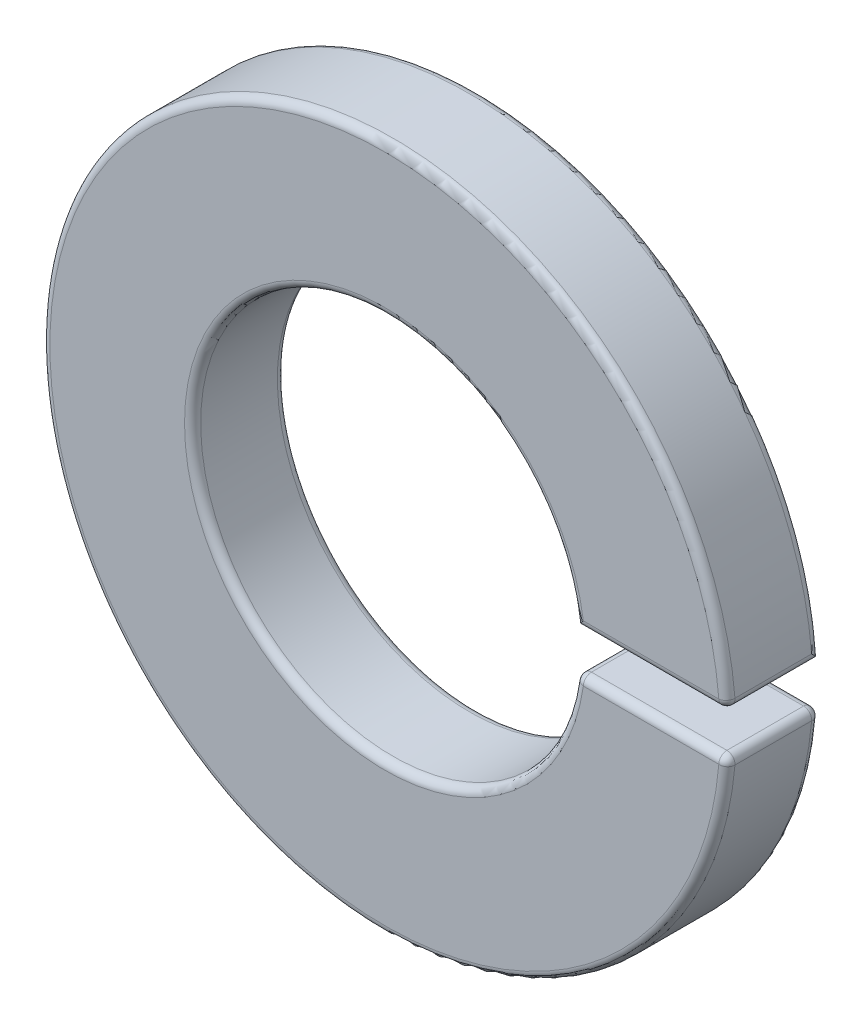
ISO-10303-21;
HEADER;
FILE_DESCRIPTION(('STEP AP214'),'2;1');
FILE_NAME('part.step','',(''),(''),'','','');
FILE_SCHEMA(('AUTOMOTIVE_DESIGN { 1 0 10303 214 1 1 1 1 }'));
ENDSEC;
DATA;
#1=APPLICATION_CONTEXT('core data for automotive mechanical design processes');
#2=APPLICATION_PROTOCOL_DEFINITION('international standard','automotive_design',2000,#1);
#3=PRODUCT_CONTEXT('',#1,'mechanical');
#4=PRODUCT('Part','Part','',(#3));
#5=PRODUCT_RELATED_PRODUCT_CATEGORY('part','',(#4));
#6=PRODUCT_DEFINITION_FORMATION('','',#4);
#7=PRODUCT_DEFINITION_CONTEXT('part definition',#1,'design');
#8=PRODUCT_DEFINITION('design','',#6,#7);
#9=PRODUCT_DEFINITION_SHAPE('','',#8);
#10=(LENGTH_UNIT() NAMED_UNIT(*) SI_UNIT(.MILLI.,.METRE.));
#11=(NAMED_UNIT(*) PLANE_ANGLE_UNIT() SI_UNIT($,.RADIAN.));
#12=(NAMED_UNIT(*) SI_UNIT($,.STERADIAN.) SOLID_ANGLE_UNIT());
#13=UNCERTAINTY_MEASURE_WITH_UNIT(LENGTH_MEASURE(1.E-05),#10,'distance_accuracy_value','');
#14=(GEOMETRIC_REPRESENTATION_CONTEXT(3) GLOBAL_UNCERTAINTY_ASSIGNED_CONTEXT((#13)) GLOBAL_UNIT_ASSIGNED_CONTEXT((#10,
#11,#12)) REPRESENTATION_CONTEXT('',''));
#15=CARTESIAN_POINT('',(0.,0.,0.));
#16=DIRECTION('',(0.,0.,1.));
#17=DIRECTION('',(1.,0.,0.));
#18=AXIS2_PLACEMENT_3D('',#15,#16,#17);
#19=CARTESIAN_POINT('',(0.,0.,2.3));
#20=DIRECTION('',(0.,0.,-1.));
#21=DIRECTION('',(-1.,0.,0.));
#22=AXIS2_PLACEMENT_3D('',#19,#20,#21);
#23=CYLINDRICAL_SURFACE('',#22,4.765);
#24=DIRECTION('',(0.,0.,-1.));
#25=VECTOR('',#24,1.);
#26=CARTESIAN_POINT('',(4.71740460868127,-0.671802618328298,2.3));
#27=LINE('',#26,#25);
#28=CARTESIAN_POINT('',(4.71740460868127,-0.671802618328298,2.1));
#29=VERTEX_POINT('',#28);
#30=CARTESIAN_POINT('',(4.71740460868127,-0.671802618328298,0.2));
#31=VERTEX_POINT('',#30);
#32=EDGE_CURVE('E134',#29,#31,#27,.T.);
#33=ORIENTED_EDGE('',*,*,#32,.T.);
#34=CARTESIAN_POINT('',(0.,0.,0.2));
#35=DIRECTION('',(0.,0.,1.));
#36=DIRECTION('',(1.,0.,0.));
#37=AXIS2_PLACEMENT_3D('',#34,#35,#36);
#38=CIRCLE('',#37,4.765);
#39=CARTESIAN_POINT('',(4.73869444045509,0.5,0.2));
#40=VERTEX_POINT('',#39);
#41=EDGE_CURVE('E133',#31,#40,#38,.F.);
#42=ORIENTED_EDGE('',*,*,#41,.T.);
#43=DIRECTION('',(0.,0.,-1.));
#44=VECTOR('',#43,1.);
#45=CARTESIAN_POINT('',(4.73869444045509,0.5,2.3));
#46=LINE('',#45,#44);
#47=CARTESIAN_POINT('',(4.73869444045509,0.5,2.1));
#48=VERTEX_POINT('',#47);
#49=EDGE_CURVE('E119',#48,#40,#46,.T.);
#50=ORIENTED_EDGE('',*,*,#49,.F.);
#51=CARTESIAN_POINT('',(0.,0.,2.1));
#52=DIRECTION('',(0.,0.,1.));
#53=DIRECTION('',(1.,0.,0.));
#54=AXIS2_PLACEMENT_3D('',#51,#52,#53);
#55=CIRCLE('',#54,4.765);
#56=EDGE_CURVE('E130',#48,#29,#55,.T.);
#57=ORIENTED_EDGE('',*,*,#56,.T.);
#58=EDGE_LOOP('',(#33,#42,#50,#57));
#59=FACE_BOUND('',#58,.T.);
#60=ADVANCED_FACE('F31',(#59),#23,.F.);
#61=CARTESIAN_POINT('',(4.73869444045509,0.5,2.3));
#62=DIRECTION('',(0.,1.,0.));
#63=DIRECTION('',(-1.,0.,0.));
#64=AXIS2_PLACEMENT_3D('',#61,#62,#63);
#65=PLANE('',#64);
#66=ORIENTED_EDGE('',*,*,#49,.T.);
#67=CARTESIAN_POINT('',(4.73869444045509,0.5,0.2));
#68=CARTESIAN_POINT('',(4.73868461401804,0.5,0.188792758093072));
#69=CARTESIAN_POINT('',(4.7396410884334,0.5,0.177588755125811));
#70=CARTESIAN_POINT('',(4.74341366546875,0.5,0.15550875346321));
#71=CARTESIAN_POINT('',(4.74622800823232,0.5,0.144632454536727));
#72=CARTESIAN_POINT('',(4.75364517402929,0.5,0.123502527787467));
#73=CARTESIAN_POINT('',(4.75824875546468,0.5,0.113249166142091));
#74=CARTESIAN_POINT('',(4.76910648277163,0.5,0.093659484119323));
#75=CARTESIAN_POINT('',(4.77536041371667,0.5,0.0843230445474286));
#76=CARTESIAN_POINT('',(4.78935710210391,0.5,0.0668042176865836));
#77=CARTESIAN_POINT('',(4.79710352136464,0.5,0.0586247564520154));
#78=CARTESIAN_POINT('',(4.81385497382244,0.5,0.0436726816665959));
#79=CARTESIAN_POINT('',(4.82286026681159,0.5,0.0369003592241723));
#80=CARTESIAN_POINT('',(4.84192317626227,0.5,0.0249185191235681));
#81=CARTESIAN_POINT('',(4.85198617769651,0.5,0.0197175782047218));
#82=CARTESIAN_POINT('',(4.87283796873628,0.5,0.0110725265967263));
#83=CARTESIAN_POINT('',(4.88362638127501,0.5,0.00762751105162984));
#84=CARTESIAN_POINT('',(4.90202227658237,0.5,0.00340993330429354));
#85=CARTESIAN_POINT('',(4.90951788592212,0.5,0.00213202017630605));
#86=CARTESIAN_POINT('',(4.92459452645471,0.5,0.000427132852026366));
#87=CARTESIAN_POINT('',(4.93217542224851,0.5,-1.03904255573628E-06));
#88=CARTESIAN_POINT('',(4.93975960953539,0.5,-1.22143199528215E-12));
#89=B_SPLINE_CURVE_WITH_KNOTS('',3,(#67,#68,#69,#70,#71,#72,#73,#74,#75,#76,#77,#78,#79,#80,#81,
#82,#83,#84,#85,#86,#87,#88),.UNSPECIFIED.,.F.,.F.,(4,2,2,2,2,2,2,2,2,2,4),(0.,
0.0335762704455082,0.0671207814880249,0.100679526527466,0.13423390333603,0.167871678978358,
0.201516406679355,0.235341584083431,0.269149313174337,0.291915512712174,0.314649600758024),.UNSPECIFIED.);
#90=CARTESIAN_POINT('',(4.93975960953567,0.5,0.));
#91=VERTEX_POINT('',#90);
#92=EDGE_CURVE('E126',#40,#91,#89,.T.);
#93=ORIENTED_EDGE('',*,*,#92,.T.);
#94=DIRECTION('',(1.,0.,0.));
#95=VECTOR('',#94,1.);
#96=CARTESIAN_POINT('',(4.73869444045509,0.5,0.));
#97=LINE('',#96,#95);
#98=CARTESIAN_POINT('',(8.27042925125413,0.5,0.));
#99=VERTEX_POINT('',#98);
#100=EDGE_CURVE('E135',#91,#99,#97,.T.);
#101=ORIENTED_EDGE('',*,*,#100,.T.);
#102=DIRECTION('',(0.,0.,-1.));
#103=VECTOR('',#102,1.);
#104=CARTESIAN_POINT('',(8.27042925125413,0.5,2.3));
#105=LINE('',#104,#103);
#106=CARTESIAN_POINT('',(8.27042925125413,0.5,2.1));
#107=VERTEX_POINT('',#106);
#108=EDGE_CURVE('E122',#99,#107,#105,.F.);
#109=ORIENTED_EDGE('',*,*,#108,.T.);
#110=DIRECTION('',(1.,0.,0.));
#111=VECTOR('',#110,1.);
#112=CARTESIAN_POINT('',(4.73869444045509,0.5,2.1));
#113=LINE('',#112,#111);
#114=EDGE_CURVE('E116',#107,#48,#113,.F.);
#115=ORIENTED_EDGE('',*,*,#114,.T.);
#116=EDGE_LOOP('',(#66,#93,#101,#109,#115));
#117=FACE_BOUND('',#116,.T.);
#118=ADVANCED_FACE('F118',(#117),#65,.F.);
#119=CARTESIAN_POINT('',(0.,0.,2.3));
#120=DIRECTION('',(0.,0.,-1.));
#121=DIRECTION('',(-1.,0.,0.));
#122=AXIS2_PLACEMENT_3D('',#119,#120,#121);
#123=CYLINDRICAL_SURFACE('',#122,8.5);
#124=CARTESIAN_POINT('',(0.,0.,0.2));
#125=DIRECTION('',(0.,0.,1.));
#126=DIRECTION('',(1.,0.,0.));
#127=AXIS2_PLACEMENT_3D('',#124,#125,#126);
#128=CIRCLE('',#127,8.5);
#129=CARTESIAN_POINT('',(8.46971670309158,0.716867469879518,0.2));
#130=VERTEX_POINT('',#129);
#131=CARTESIAN_POINT('',(8.46971670309158,-0.716867469879518,0.2));
#132=VERTEX_POINT('',#131);
#133=EDGE_CURVE('E418',#130,#132,#128,.T.);
#134=ORIENTED_EDGE('',*,*,#133,.T.);
#135=DIRECTION('',(0.,0.,-1.));
#136=VECTOR('',#135,1.);
#137=CARTESIAN_POINT('',(8.46971670309158,-0.716867469879518,2.3));
#138=LINE('',#137,#136);
#139=CARTESIAN_POINT('',(8.46971670309158,-0.716867469879518,2.1));
#140=VERTEX_POINT('',#139);
#141=EDGE_CURVE('E420',#132,#140,#138,.F.);
#142=ORIENTED_EDGE('',*,*,#141,.T.);
#143=CARTESIAN_POINT('',(0.,0.,2.1));
#144=DIRECTION('',(0.,0.,1.));
#145=DIRECTION('',(1.,0.,0.));
#146=AXIS2_PLACEMENT_3D('',#143,#144,#145);
#147=CIRCLE('',#146,8.5);
#148=CARTESIAN_POINT('',(8.46971670309158,0.716867469879518,2.1));
#149=VERTEX_POINT('',#148);
#150=EDGE_CURVE('E421',#140,#149,#147,.F.);
#151=ORIENTED_EDGE('',*,*,#150,.T.);
#152=DIRECTION('',(0.,0.,-1.));
#153=VECTOR('',#152,1.);
#154=CARTESIAN_POINT('',(8.46971670309158,0.716867469879518,2.3));
#155=LINE('',#154,#153);
#156=EDGE_CURVE('E425',#149,#130,#155,.T.);
#157=ORIENTED_EDGE('',*,*,#156,.T.);
#158=EDGE_LOOP('',(#134,#142,#151,#157));
#159=FACE_BOUND('',#158,.T.);
#160=ADVANCED_FACE('F165',(#159),#123,.T.);
#161=CARTESIAN_POINT('',(4.73869444045509,-0.5,2.3));
#162=DIRECTION('',(0.,-1.,0.));
#163=DIRECTION('',(1.,0.,0.));
#164=AXIS2_PLACEMENT_3D('',#161,#162,#163);
#165=PLANE('',#164);
#166=DIRECTION('',(-1.,0.,0.));
#167=VECTOR('',#166,1.);
#168=CARTESIAN_POINT('',(4.73869444045509,-0.5,0.2));
#169=LINE('',#168,#167);
#170=CARTESIAN_POINT('',(8.27042925125413,-0.5,0.2));
#171=VERTEX_POINT('',#170);
#172=CARTESIAN_POINT('',(4.91540690075603,-0.5,0.2));
#173=VERTEX_POINT('',#172);
#174=EDGE_CURVE('E432',#171,#173,#169,.T.);
#175=ORIENTED_EDGE('',*,*,#174,.T.);
#176=DIRECTION('',(0.,0.,-1.));
#177=VECTOR('',#176,1.);
#178=CARTESIAN_POINT('',(4.91540690075603,-0.5,2.3));
#179=LINE('',#178,#177);
#180=CARTESIAN_POINT('',(4.91540690075603,-0.5,2.1));
#181=VERTEX_POINT('',#180);
#182=EDGE_CURVE('E435',#173,#181,#179,.F.);
#183=ORIENTED_EDGE('',*,*,#182,.T.);
#184=DIRECTION('',(-1.,0.,0.));
#185=VECTOR('',#184,1.);
#186=CARTESIAN_POINT('',(8.48528137423857,-0.5,2.1));
#187=LINE('',#186,#185);
#188=CARTESIAN_POINT('',(8.27042925125413,-0.5,2.1));
#189=VERTEX_POINT('',#188);
#190=EDGE_CURVE('E430',#181,#189,#187,.F.);
#191=ORIENTED_EDGE('',*,*,#190,.T.);
#192=DIRECTION('',(0.,0.,-1.));
#193=VECTOR('',#192,1.);
#194=CARTESIAN_POINT('',(8.27042925125413,-0.5,2.3));
#195=LINE('',#194,#193);
#196=EDGE_CURVE('E423',#189,#171,#195,.T.);
#197=ORIENTED_EDGE('',*,*,#196,.T.);
#198=EDGE_LOOP('',(#175,#183,#191,#197));
#199=FACE_BOUND('',#198,.T.);
#200=ADVANCED_FACE('F180',(#199),#165,.F.);
#201=CARTESIAN_POINT('',(0.,0.,2.3));
#202=DIRECTION('',(0.,0.,1.));
#203=DIRECTION('',(1.,0.,0.));
#204=AXIS2_PLACEMENT_3D('',#201,#202,#203);
#205=PLANE('',#204);
#206=DIRECTION('',(-1.,0.,0.));
#207=VECTOR('',#206,1.);
#208=CARTESIAN_POINT('',(4.73869444045509,-0.7,2.3));
#209=LINE('',#208,#207);
#210=CARTESIAN_POINT('',(8.27042925125413,-0.7,2.3));
#211=VERTEX_POINT('',#210);
#212=CARTESIAN_POINT('',(4.91540690075603,-0.7,2.3));
#213=VERTEX_POINT('',#212);
#214=EDGE_CURVE('E437',#211,#213,#209,.T.);
#215=ORIENTED_EDGE('',*,*,#214,.T.);
#216=CARTESIAN_POINT('',(0.,0.,2.3));
#217=DIRECTION('',(0.,0.,1.));
#218=DIRECTION('',(1.,0.,0.));
#219=AXIS2_PLACEMENT_3D('',#216,#217,#218);
#220=CIRCLE('',#219,4.965);
#221=CARTESIAN_POINT('',(4.91540690075603,0.7,2.3));
#222=VERTEX_POINT('',#221);
#223=EDGE_CURVE('E11',#213,#222,#220,.F.);
#224=ORIENTED_EDGE('',*,*,#223,.T.);
#225=DIRECTION('',(1.,0.,0.));
#226=VECTOR('',#225,1.);
#227=CARTESIAN_POINT('',(8.48528137423857,0.7,2.3));
#228=LINE('',#227,#226);
#229=CARTESIAN_POINT('',(8.27042925125413,0.7,2.3));
#230=VERTEX_POINT('',#229);
#231=EDGE_CURVE('E40',#222,#230,#228,.T.);
#232=ORIENTED_EDGE('',*,*,#231,.T.);
#233=CARTESIAN_POINT('',(0.,0.,2.3));
#234=DIRECTION('',(0.,0.,1.));
#235=DIRECTION('',(1.,0.,0.));
#236=AXIS2_PLACEMENT_3D('',#233,#234,#235);
#237=CIRCLE('',#236,8.3);
#238=EDGE_CURVE('E439',#230,#211,#237,.T.);
#239=ORIENTED_EDGE('',*,*,#238,.T.);
#240=EDGE_LOOP('',(#215,#224,#232,#239));
#241=FACE_BOUND('',#240,.T.);
#242=ADVANCED_FACE('F187',(#241),#205,.T.);
#243=CARTESIAN_POINT('',(0.,0.,0.));
#244=DIRECTION('',(0.,0.,1.));
#245=DIRECTION('',(1.,0.,0.));
#246=AXIS2_PLACEMENT_3D('',#243,#244,#245);
#247=PLANE('',#246);
#248=ORIENTED_EDGE('',*,*,#100,.F.);
#249=CARTESIAN_POINT('',(0.,0.,0.));
#250=DIRECTION('',(0.,0.,1.));
#251=DIRECTION('',(1.,0.,0.));
#252=AXIS2_PLACEMENT_3D('',#249,#250,#251);
#253=CIRCLE('',#252,4.965);
#254=CARTESIAN_POINT('',(4.91540690075603,-0.7,0.));
#255=VERTEX_POINT('',#254);
#256=EDGE_CURVE('E360',#91,#255,#253,.T.);
#257=ORIENTED_EDGE('',*,*,#256,.T.);
#258=DIRECTION('',(-1.,0.,0.));
#259=VECTOR('',#258,1.);
#260=CARTESIAN_POINT('',(0.,-0.7,0.));
#261=LINE('',#260,#259);
#262=CARTESIAN_POINT('',(8.27042925125413,-0.7,0.));
#263=VERTEX_POINT('',#262);
#264=EDGE_CURVE('E456',#255,#263,#261,.F.);
#265=ORIENTED_EDGE('',*,*,#264,.T.);
#266=CARTESIAN_POINT('',(0.,0.,0.));
#267=DIRECTION('',(0.,0.,1.));
#268=DIRECTION('',(1.,0.,0.));
#269=AXIS2_PLACEMENT_3D('',#266,#267,#268);
#270=CIRCLE('',#269,8.3);
#271=CARTESIAN_POINT('',(8.28489444322052,0.500523790337354,0.));
#272=VERTEX_POINT('',#271);
#273=EDGE_CURVE('E414',#263,#272,#270,.F.);
#274=ORIENTED_EDGE('',*,*,#273,.T.);
#275=CARTESIAN_POINT('',(8.27042925125413,0.7,0.));
#276=DIRECTION('',(0.,0.,1.));
#277=DIRECTION('',(1.,0.,0.));
#278=AXIS2_PLACEMENT_3D('',#275,#276,#277);
#279=CIRCLE('',#278,0.2);
#280=EDGE_CURVE('E156',#272,#99,#279,.F.);
#281=ORIENTED_EDGE('',*,*,#280,.T.);
#282=EDGE_LOOP('',(#248,#257,#265,#274,#281));
#283=FACE_BOUND('',#282,.T.);
#284=ADVANCED_FACE('F194',(#283),#247,.F.);
#285=CARTESIAN_POINT('',(0.,0.,2.1));
#286=DIRECTION('',(0.,0.,1.));
#287=DIRECTION('',(1.,0.,0.));
#288=AXIS2_PLACEMENT_3D('',#285,#286,#287);
#289=TOROIDAL_SURFACE('',#288,8.3,0.2);
#290=CARTESIAN_POINT('',(8.27042925125413,0.7,2.1));
#291=DIRECTION('',(0.0843373493975904,-0.996437259187245,0.));
#292=DIRECTION('',(0.996437259187245,0.0843373493975904,0.));
#293=AXIS2_PLACEMENT_3D('',#290,#291,#292);
#294=CIRCLE('',#293,0.2);
#295=EDGE_CURVE('E35',#149,#230,#294,.T.);
#296=ORIENTED_EDGE('',*,*,#295,.F.);
#297=ORIENTED_EDGE('',*,*,#150,.F.);
#298=CARTESIAN_POINT('',(8.27042925125413,-0.7,2.1));
#299=DIRECTION('',(0.0843373493975909,0.996437259187245,0.));
#300=DIRECTION('',(-0.996437259187245,0.0843373493975909,0.));
#301=AXIS2_PLACEMENT_3D('',#298,#299,#300);
#302=CIRCLE('',#301,0.2);
#303=EDGE_CURVE('E401',#211,#140,#302,.T.);
#304=ORIENTED_EDGE('',*,*,#303,.F.);
#305=ORIENTED_EDGE('',*,*,#238,.F.);
#306=EDGE_LOOP('',(#296,#297,#304,#305));
#307=FACE_BOUND('',#306,.T.);
#308=ADVANCED_FACE('F33',(#307),#289,.T.);
#309=CARTESIAN_POINT('',(8.27042925125413,0.7,2.1));
#310=DIRECTION('',(0.,0.,1.));
#311=DIRECTION('',(1.,0.,0.));
#312=AXIS2_PLACEMENT_3D('',#309,#310,#311);
#313=SPHERICAL_SURFACE('',#312,0.2);
#314=CARTESIAN_POINT('',(8.27042925125413,0.7,2.1));
#315=DIRECTION('',(1.,0.,0.));
#316=DIRECTION('',(0.,0.,-1.));
#317=AXIS2_PLACEMENT_3D('',#314,#315,#316);
#318=CIRCLE('',#317,0.2);
#319=EDGE_CURVE('E398',#107,#230,#318,.F.);
#320=ORIENTED_EDGE('',*,*,#319,.F.);
#321=CARTESIAN_POINT('',(8.27042925125413,0.7,2.1));
#322=DIRECTION('',(0.,0.,1.));
#323=DIRECTION('',(1.,0.,0.));
#324=AXIS2_PLACEMENT_3D('',#321,#322,#323);
#325=CIRCLE('',#324,0.2);
#326=EDGE_CURVE('E403',#149,#107,#325,.F.);
#327=ORIENTED_EDGE('',*,*,#326,.F.);
#328=ORIENTED_EDGE('',*,*,#295,.T.);
#329=EDGE_LOOP('',(#320,#327,#328));
#330=FACE_BOUND('',#329,.T.);
#331=ADVANCED_FACE('F208',(#330),#313,.T.);
#332=CARTESIAN_POINT('',(8.27042925125413,0.7,2.3));
#333=DIRECTION('',(0.,0.,-1.));
#334=DIRECTION('',(-1.,0.,0.));
#335=AXIS2_PLACEMENT_3D('',#332,#333,#334);
#336=CYLINDRICAL_SURFACE('',#335,0.2);
#337=ORIENTED_EDGE('',*,*,#108,.F.);
#338=ORIENTED_EDGE('',*,*,#280,.F.);
#339=CARTESIAN_POINT('',(8.28489444322052,0.500523790337354,0.));
#340=CARTESIAN_POINT('',(8.29387544865428,0.501159922991079,-1.4841051488482E-05));
#341=CARTESIAN_POINT('',(8.30278687363828,0.502429767760512,0.000606855819964839));
#342=CARTESIAN_POINT('',(8.32014328327373,0.506080412470303,0.00298639989202258));
#343=CARTESIAN_POINT('',(8.32859165503432,0.508451437940252,0.00473430232249888));
#344=CARTESIAN_POINT('',(8.34483673027622,0.514155897401381,0.00922715251516636));
#345=CARTESIAN_POINT('',(8.35263521604406,0.517486579530057,0.0119692550881506));
#346=CARTESIAN_POINT('',(8.36749759896586,0.524937244862746,0.0182817554732389));
#347=CARTESIAN_POINT('',(8.37455976916183,0.529059021972253,0.0218540397826292));
#348=CARTESIAN_POINT('',(8.39059593726718,0.539728937429342,0.0312536506964467));
#349=CARTESIAN_POINT('',(8.39917632527819,0.546581380306941,0.0374067133555681));
#350=CARTESIAN_POINT('',(8.41475169568796,0.561129311677307,0.050645443315029));
#351=CARTESIAN_POINT('',(8.42174367897104,0.56882635492779,0.0577328355450061));
#352=CARTESIAN_POINT('',(8.43656678236745,0.587783516669081,0.0753474831704552));
#353=CARTESIAN_POINT('',(8.44372645759705,0.599295948365319,0.0861667973569296));
#354=CARTESIAN_POINT('',(8.45543976679454,0.622896354758953,0.10854826682529));
#355=CARTESIAN_POINT('',(8.45999032557245,0.634984990495579,0.120111280885132));
#356=CARTESIAN_POINT('',(8.46639884839118,0.658397900802713,0.142679813547924));
#357=CARTESIAN_POINT('',(8.46844798009609,0.669702956360888,0.153652624178162));
#358=CARTESIAN_POINT('',(8.47060298044938,0.692313266888671,0.175748599269746));
#359=CARTESIAN_POINT('',(8.47071281360384,0.703618474193991,0.186871410459481));
#360=CARTESIAN_POINT('',(8.46982772693985,0.715514732979109,0.198658782151559));
#361=CARTESIAN_POINT('',(8.46977393146643,0.716191268251252,0.199329412285568));
#362=CARTESIAN_POINT('',(8.46971670309158,0.716867469879518,0.2));
#363=B_SPLINE_CURVE_WITH_KNOTS('',3,(#339,#340,#341,#342,#343,#344,#345,#346,#347,#348,#349,
#350,#351,#352,#353,#354,#355,#356,#357,#358,#359,#360,#361,#362),.UNSPECIFIED.,.F.,.F.,(4,2,2,
2,2,2,2,2,2,2,2,4),(0.,0.0269304008478524,0.053626197137375,0.080246191082651,0.106927277993508,
0.14448064538074,0.182104339774481,0.233861438374578,0.285679414842823,0.333222385863751,
0.380668153558253,0.383530474029315),.UNSPECIFIED.);
#364=EDGE_CURVE('E392',#130,#272,#363,.F.);
#365=ORIENTED_EDGE('',*,*,#364,.F.);
#366=ORIENTED_EDGE('',*,*,#156,.F.);
#367=ORIENTED_EDGE('',*,*,#326,.T.);
#368=EDGE_LOOP('',(#337,#338,#365,#366,#367));
#369=FACE_BOUND('',#368,.T.);
#370=ADVANCED_FACE('F215',(#369),#336,.T.);
#371=CARTESIAN_POINT('',(8.27042925125413,-0.7,2.1));
#372=DIRECTION('',(0.,0.,1.));
#373=DIRECTION('',(1.,0.,0.));
#374=AXIS2_PLACEMENT_3D('',#371,#372,#373);
#375=SPHERICAL_SURFACE('',#374,0.2);
#376=CARTESIAN_POINT('',(8.27042925125413,-0.7,2.1));
#377=DIRECTION('',(1.,0.,0.));
#378=DIRECTION('',(0.,0.,-1.));
#379=AXIS2_PLACEMENT_3D('',#376,#377,#378);
#380=CIRCLE('',#379,0.2);
#381=EDGE_CURVE('E138',#211,#189,#380,.F.);
#382=ORIENTED_EDGE('',*,*,#381,.F.);
#383=ORIENTED_EDGE('',*,*,#303,.T.);
#384=CARTESIAN_POINT('',(8.27042925125413,-0.7,2.1));
#385=DIRECTION('',(0.,0.,1.));
#386=DIRECTION('',(1.,0.,0.));
#387=AXIS2_PLACEMENT_3D('',#384,#385,#386);
#388=CIRCLE('',#387,0.2);
#389=EDGE_CURVE('E399',#189,#140,#388,.F.);
#390=ORIENTED_EDGE('',*,*,#389,.F.);
#391=EDGE_LOOP('',(#382,#383,#390));
#392=FACE_BOUND('',#391,.T.);
#393=ADVANCED_FACE('F222',(#392),#375,.T.);
#394=CARTESIAN_POINT('',(0.,0.7,2.1));
#395=DIRECTION('',(-1.,0.,0.));
#396=DIRECTION('',(0.,-1.,0.));
#397=AXIS2_PLACEMENT_3D('',#394,#395,#396);
#398=CYLINDRICAL_SURFACE('',#397,0.2);
#399=ORIENTED_EDGE('',*,*,#319,.T.);
#400=ORIENTED_EDGE('',*,*,#231,.F.);
#401=CARTESIAN_POINT('',(4.73869444045509,0.5,2.1));
#402=CARTESIAN_POINT('',(4.73868069370812,0.49998513177145,2.10925720901644));
#403=CARTESIAN_POINT('',(4.73927196514721,0.500641657298907,2.11849398372718));
#404=CARTESIAN_POINT('',(4.74154635653833,0.503169365766518,2.13659072816783));
#405=CARTESIAN_POINT('',(4.74322095285968,0.505031066430951,2.14545306892629));
#406=CARTESIAN_POINT('',(4.74754203307665,0.509838924990881,2.16259726308621));
#407=CARTESIAN_POINT('',(4.75018625907436,0.512782563502365,2.17088041227195));
#408=CARTESIAN_POINT('',(4.75629126806795,0.519586426640813,2.18675029872724));
#409=CARTESIAN_POINT('',(4.75975368261807,0.523448482788336,2.194335601877));
#410=CARTESIAN_POINT('',(4.76871569585999,0.533458136763589,2.21132455530815));
#411=CARTESIAN_POINT('',(4.77449867108178,0.539926614838568,2.22038966916557));
#412=CARTESIAN_POINT('',(4.78694997055251,0.553883474576156,2.23699669425637));
#413=CARTESIAN_POINT('',(4.79361985369912,0.561373652670066,2.24453586313029));
#414=CARTESIAN_POINT('',(4.80977854785553,0.579561647950438,2.26025282023912));
#415=CARTESIAN_POINT('',(4.81949427599428,0.590527504146023,2.26788600403262));
#416=CARTESIAN_POINT('',(4.83957245772162,0.613263244069077,2.28068526535244));
#417=CARTESIAN_POINT('',(4.84993539021435,0.625033723808149,2.28584949090123));
#418=CARTESIAN_POINT('',(4.86917558427343,0.646960116246744,2.29312180440672));
#419=CARTESIAN_POINT('',(4.87799922831531,0.657042501039001,2.29560433745266));
#420=CARTESIAN_POINT('',(4.89573582072089,0.677365283713595,2.29898109318449));
#421=CARTESIAN_POINT('',(4.90464855475763,0.687605324565721,2.29987848792753));
#422=CARTESIAN_POINT('',(4.91416486901525,0.698568694874058,2.2999961571581));
#423=CARTESIAN_POINT('',(4.9147859398122,0.699284342426706,2.29999999809171));
#424=CARTESIAN_POINT('',(4.91540690075603,0.7,2.3));
#425=B_SPLINE_CURVE_WITH_KNOTS('',3,(#401,#402,#403,#404,#405,#406,#407,#408,#409,#410,#411,
#412,#413,#414,#415,#416,#417,#418,#419,#420,#421,#422,#423,#424),.UNSPECIFIED.,.F.,.F.,(4,2,2,
2,2,2,2,2,2,2,2,4),(0.,0.0276971628525006,0.0551790113115681,0.082597267242826,
0.110070666448018,0.147510117962824,0.185016267948464,0.234315809099493,0.283652272279201,
0.32444211285094,0.365150235053994,0.367992918187624),.UNSPECIFIED.);
#426=EDGE_CURVE('E48',#48,#222,#425,.T.);
#427=ORIENTED_EDGE('',*,*,#426,.F.);
#428=ORIENTED_EDGE('',*,*,#114,.F.);
#429=EDGE_LOOP('',(#399,#400,#427,#428));
#430=FACE_BOUND('',#429,.T.);
#431=ADVANCED_FACE('F137',(#430),#398,.T.);
#432=CARTESIAN_POINT('',(0.,0.,0.2));
#433=DIRECTION('',(0.,0.,1.));
#434=DIRECTION('',(1.,0.,0.));
#435=AXIS2_PLACEMENT_3D('',#432,#433,#434);
#436=TOROIDAL_SURFACE('',#435,8.3,0.2);
#437=ORIENTED_EDGE('',*,*,#364,.T.);
#438=ORIENTED_EDGE('',*,*,#273,.F.);
#439=CARTESIAN_POINT('',(8.27042925125413,-0.7,0.2));
#440=DIRECTION('',(0.0843373493975904,0.996437259187245,0.));
#441=DIRECTION('',(-0.996437259187245,0.0843373493975904,0.));
#442=AXIS2_PLACEMENT_3D('',#439,#440,#441);
#443=CIRCLE('',#442,0.2);
#444=EDGE_CURVE('E139',#132,#263,#443,.T.);
#445=ORIENTED_EDGE('',*,*,#444,.F.);
#446=ORIENTED_EDGE('',*,*,#133,.F.);
#447=EDGE_LOOP('',(#437,#438,#445,#446));
#448=FACE_BOUND('',#447,.T.);
#449=ADVANCED_FACE('F237',(#448),#436,.T.);
#450=CARTESIAN_POINT('',(8.27042925125413,-0.7,2.3));
#451=DIRECTION('',(0.,0.,-1.));
#452=DIRECTION('',(-1.,0.,0.));
#453=AXIS2_PLACEMENT_3D('',#450,#451,#452);
#454=CYLINDRICAL_SURFACE('',#453,0.2);
#455=ORIENTED_EDGE('',*,*,#389,.T.);
#456=ORIENTED_EDGE('',*,*,#141,.F.);
#457=CARTESIAN_POINT('',(8.27042925125413,-0.7,0.2));
#458=DIRECTION('',(0.,0.,-1.));
#459=DIRECTION('',(-1.,0.,0.));
#460=AXIS2_PLACEMENT_3D('',#457,#458,#459);
#461=CIRCLE('',#460,0.2);
#462=EDGE_CURVE('E379',#171,#132,#461,.T.);
#463=ORIENTED_EDGE('',*,*,#462,.F.);
#464=ORIENTED_EDGE('',*,*,#196,.F.);
#465=EDGE_LOOP('',(#455,#456,#463,#464));
#466=FACE_BOUND('',#465,.T.);
#467=ADVANCED_FACE('F244',(#466),#454,.T.);
#468=CARTESIAN_POINT('',(0.,-0.7,2.1));
#469=DIRECTION('',(1.,0.,0.));
#470=DIRECTION('',(0.,1.,0.));
#471=AXIS2_PLACEMENT_3D('',#468,#469,#470);
#472=CYLINDRICAL_SURFACE('',#471,0.2);
#473=ORIENTED_EDGE('',*,*,#381,.T.);
#474=ORIENTED_EDGE('',*,*,#190,.F.);
#475=CARTESIAN_POINT('',(4.91540690075603,-0.7,2.1));
#476=DIRECTION('',(-1.,0.,0.));
#477=DIRECTION('',(0.,0.,1.));
#478=AXIS2_PLACEMENT_3D('',#475,#476,#477);
#479=CIRCLE('',#478,0.2);
#480=EDGE_CURVE('E376',#213,#181,#479,.T.);
#481=ORIENTED_EDGE('',*,*,#480,.F.);
#482=ORIENTED_EDGE('',*,*,#214,.F.);
#483=EDGE_LOOP('',(#473,#474,#481,#482));
#484=FACE_BOUND('',#483,.T.);
#485=ADVANCED_FACE('F252',(#484),#472,.T.);
#486=CARTESIAN_POINT('',(0.,0.,2.1));
#487=DIRECTION('',(0.,0.,1.));
#488=DIRECTION('',(1.,0.,0.));
#489=AXIS2_PLACEMENT_3D('',#486,#487,#488);
#490=TOROIDAL_SURFACE('',#489,4.965,0.2);
#491=ORIENTED_EDGE('',*,*,#426,.T.);
#492=ORIENTED_EDGE('',*,*,#223,.F.);
#493=CARTESIAN_POINT('',(4.91540690075603,-0.7,2.1));
#494=DIRECTION('',(0.14098690835851,0.990011460373823,0.));
#495=DIRECTION('',(-0.990011460373823,0.14098690835851,0.));
#496=AXIS2_PLACEMENT_3D('',#493,#494,#495);
#497=CIRCLE('',#496,0.2);
#498=EDGE_CURVE('E143',#29,#213,#497,.T.);
#499=ORIENTED_EDGE('',*,*,#498,.F.);
#500=ORIENTED_EDGE('',*,*,#56,.F.);
#501=EDGE_LOOP('',(#491,#492,#499,#500));
#502=FACE_BOUND('',#501,.T.);
#503=ADVANCED_FACE('F141',(#502),#490,.T.);
#504=CARTESIAN_POINT('',(8.27042925125413,-0.7,0.2));
#505=DIRECTION('',(0.,0.,1.));
#506=DIRECTION('',(1.,0.,0.));
#507=AXIS2_PLACEMENT_3D('',#504,#505,#506);
#508=SPHERICAL_SURFACE('',#507,0.2);
#509=ORIENTED_EDGE('',*,*,#462,.T.);
#510=ORIENTED_EDGE('',*,*,#444,.T.);
#511=CARTESIAN_POINT('',(8.27042925125413,-0.7,0.2));
#512=DIRECTION('',(1.,0.,0.));
#513=DIRECTION('',(0.,0.,-1.));
#514=AXIS2_PLACEMENT_3D('',#511,#512,#513);
#515=CIRCLE('',#514,0.2);
#516=EDGE_CURVE('E372',#171,#263,#515,.F.);
#517=ORIENTED_EDGE('',*,*,#516,.F.);
#518=EDGE_LOOP('',(#509,#510,#517));
#519=FACE_BOUND('',#518,.T.);
#520=ADVANCED_FACE('F267',(#519),#508,.T.);
#521=CARTESIAN_POINT('',(4.91540690075603,-0.7,2.1));
#522=DIRECTION('',(0.,0.,1.));
#523=DIRECTION('',(1.,0.,0.));
#524=AXIS2_PLACEMENT_3D('',#521,#522,#523);
#525=SPHERICAL_SURFACE('',#524,0.2);
#526=ORIENTED_EDGE('',*,*,#498,.T.);
#527=ORIENTED_EDGE('',*,*,#480,.T.);
#528=CARTESIAN_POINT('',(4.91540690075603,-0.7,2.1));
#529=DIRECTION('',(0.,0.,1.));
#530=DIRECTION('',(1.,0.,0.));
#531=AXIS2_PLACEMENT_3D('',#528,#529,#530);
#532=CIRCLE('',#531,0.2);
#533=EDGE_CURVE('E369',#29,#181,#532,.F.);
#534=ORIENTED_EDGE('',*,*,#533,.F.);
#535=EDGE_LOOP('',(#526,#527,#534));
#536=FACE_BOUND('',#535,.T.);
#537=ADVANCED_FACE('F274',(#536),#525,.T.);
#538=CARTESIAN_POINT('',(4.73869444045509,-0.7,0.2));
#539=DIRECTION('',(-1.,0.,0.));
#540=DIRECTION('',(0.,-1.,0.));
#541=AXIS2_PLACEMENT_3D('',#538,#539,#540);
#542=CYLINDRICAL_SURFACE('',#541,0.2);
#543=ORIENTED_EDGE('',*,*,#516,.T.);
#544=ORIENTED_EDGE('',*,*,#264,.F.);
#545=CARTESIAN_POINT('',(4.91540690075603,-0.7,0.2));
#546=DIRECTION('',(-1.,0.,0.));
#547=DIRECTION('',(0.,0.,1.));
#548=AXIS2_PLACEMENT_3D('',#545,#546,#547);
#549=CIRCLE('',#548,0.2);
#550=EDGE_CURVE('E364',#173,#255,#549,.T.);
#551=ORIENTED_EDGE('',*,*,#550,.F.);
#552=ORIENTED_EDGE('',*,*,#174,.F.);
#553=EDGE_LOOP('',(#543,#544,#551,#552));
#554=FACE_BOUND('',#553,.T.);
#555=ADVANCED_FACE('F282',(#554),#542,.T.);
#556=CARTESIAN_POINT('',(4.91540690075603,-0.7,2.3));
#557=DIRECTION('',(0.,0.,-1.));
#558=DIRECTION('',(-1.,0.,0.));
#559=AXIS2_PLACEMENT_3D('',#556,#557,#558);
#560=CYLINDRICAL_SURFACE('',#559,0.2);
#561=ORIENTED_EDGE('',*,*,#533,.T.);
#562=ORIENTED_EDGE('',*,*,#182,.F.);
#563=CARTESIAN_POINT('',(4.91540690075603,-0.7,0.2));
#564=DIRECTION('',(0.,0.,-1.));
#565=DIRECTION('',(-1.,0.,0.));
#566=AXIS2_PLACEMENT_3D('',#563,#564,#565);
#567=CIRCLE('',#566,0.2);
#568=EDGE_CURVE('E362',#31,#173,#567,.T.);
#569=ORIENTED_EDGE('',*,*,#568,.F.);
#570=ORIENTED_EDGE('',*,*,#32,.F.);
#571=EDGE_LOOP('',(#561,#562,#569,#570));
#572=FACE_BOUND('',#571,.T.);
#573=ADVANCED_FACE('F290',(#572),#560,.T.);
#574=CARTESIAN_POINT('',(4.91540690075603,-0.7,0.2));
#575=DIRECTION('',(0.,0.,1.));
#576=DIRECTION('',(1.,0.,0.));
#577=AXIS2_PLACEMENT_3D('',#574,#575,#576);
#578=SPHERICAL_SURFACE('',#577,0.2);
#579=ORIENTED_EDGE('',*,*,#568,.T.);
#580=ORIENTED_EDGE('',*,*,#550,.T.);
#581=CARTESIAN_POINT('',(4.91540690075603,-0.7,0.2));
#582=DIRECTION('',(0.140986908358509,0.990011460373823,0.));
#583=DIRECTION('',(-0.990011460373823,0.140986908358509,0.));
#584=AXIS2_PLACEMENT_3D('',#581,#582,#583);
#585=CIRCLE('',#584,0.2);
#586=EDGE_CURVE('E359',#31,#255,#585,.F.);
#587=ORIENTED_EDGE('',*,*,#586,.F.);
#588=EDGE_LOOP('',(#579,#580,#587));
#589=FACE_BOUND('',#588,.T.);
#590=ADVANCED_FACE('F298',(#589),#578,.T.);
#591=CARTESIAN_POINT('',(0.,0.,0.2));
#592=DIRECTION('',(0.,0.,1.));
#593=DIRECTION('',(1.,0.,0.));
#594=AXIS2_PLACEMENT_3D('',#591,#592,#593);
#595=TOROIDAL_SURFACE('',#594,4.965,0.2);
#596=ORIENTED_EDGE('',*,*,#586,.T.);
#597=ORIENTED_EDGE('',*,*,#256,.F.);
#598=ORIENTED_EDGE('',*,*,#92,.F.);
#599=ORIENTED_EDGE('',*,*,#41,.F.);
#600=EDGE_LOOP('',(#596,#597,#598,#599));
#601=FACE_BOUND('',#600,.T.);
#602=ADVANCED_FACE('F158',(#601),#595,.T.);
#603=CLOSED_SHELL('',(#60,#118,#160,#200,#242,#284,#308,#331,#370,#393,#431,#449,#467,#485,#503,
#520,#537,#555,#573,#590,#602));
#604=MANIFOLD_SOLID_BREP('B2',#603);
#605=ADVANCED_BREP_SHAPE_REPRESENTATION('',(#18,#604),#14);
#606=SHAPE_DEFINITION_REPRESENTATION(#9,#605);
ENDSEC;
END-ISO-10303-21;
